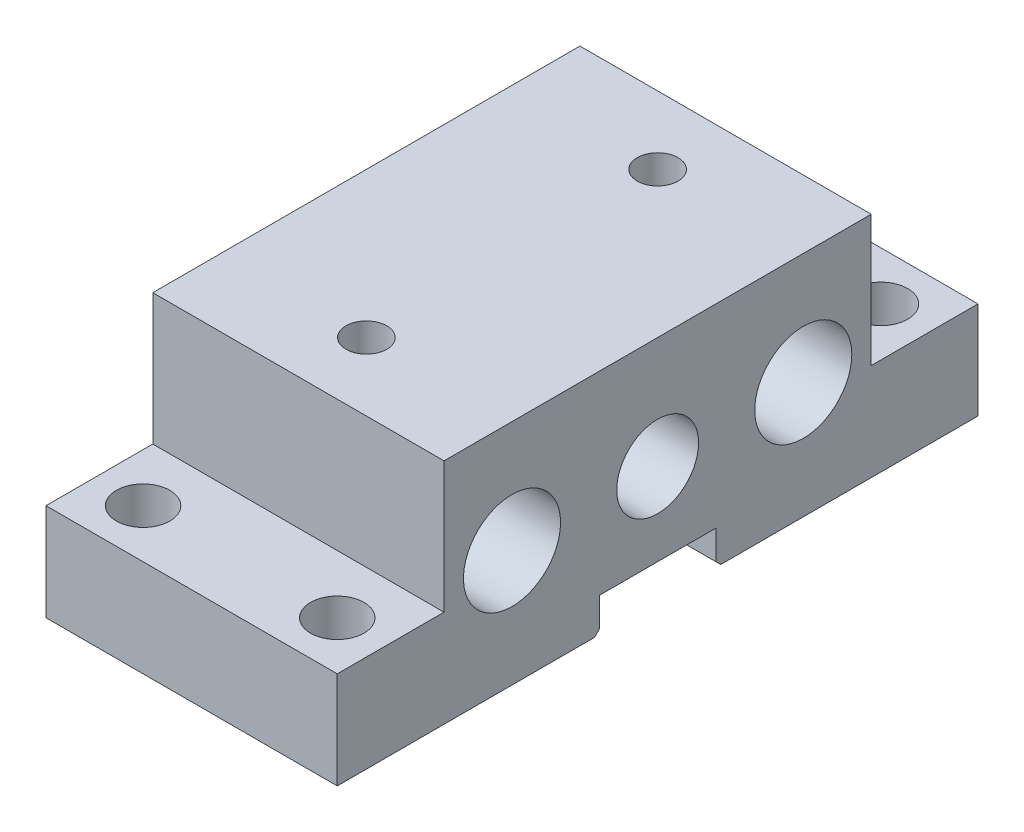
ISO-10303-21;
HEADER;
FILE_DESCRIPTION(('STEP AP214'),'2;1');
FILE_NAME('part.step','',(''),(''),'','','');
FILE_SCHEMA(('AUTOMOTIVE_DESIGN { 1 0 10303 214 1 1 1 1 }'));
ENDSEC;
DATA;
#1=APPLICATION_CONTEXT('core data for automotive mechanical design processes');
#2=APPLICATION_PROTOCOL_DEFINITION('international standard','automotive_design',2000,#1);
#3=PRODUCT_CONTEXT('',#1,'mechanical');
#4=PRODUCT('Part','Part','',(#3));
#5=PRODUCT_RELATED_PRODUCT_CATEGORY('part','',(#4));
#6=PRODUCT_DEFINITION_FORMATION('','',#4);
#7=PRODUCT_DEFINITION_CONTEXT('part definition',#1,'design');
#8=PRODUCT_DEFINITION('design','',#6,#7);
#9=PRODUCT_DEFINITION_SHAPE('','',#8);
#10=(LENGTH_UNIT() NAMED_UNIT(*) SI_UNIT(.MILLI.,.METRE.));
#11=(NAMED_UNIT(*) PLANE_ANGLE_UNIT() SI_UNIT($,.RADIAN.));
#12=(NAMED_UNIT(*) SI_UNIT($,.STERADIAN.) SOLID_ANGLE_UNIT());
#13=UNCERTAINTY_MEASURE_WITH_UNIT(LENGTH_MEASURE(1.E-05),#10,'distance_accuracy_value','');
#14=(GEOMETRIC_REPRESENTATION_CONTEXT(3) GLOBAL_UNCERTAINTY_ASSIGNED_CONTEXT((#13)) GLOBAL_UNIT_ASSIGNED_CONTEXT((#10,
#11,#12)) REPRESENTATION_CONTEXT('',''));
#15=CARTESIAN_POINT('',(0.,0.,0.));
#16=DIRECTION('',(0.,0.,1.));
#17=DIRECTION('',(1.,0.,0.));
#18=AXIS2_PLACEMENT_3D('',#15,#16,#17);
#19=CARTESIAN_POINT('',(15.,0.,33.));
#20=DIRECTION('',(0.,1.,0.));
#21=DIRECTION('',(0.,0.,1.));
#22=AXIS2_PLACEMENT_3D('',#19,#20,#21);
#23=PLANE('',#22);
#24=CARTESIAN_POINT('',(-10.,0.,28.));
#25=DIRECTION('',(0.,1.,0.));
#26=DIRECTION('',(0.,0.,1.));
#27=AXIS2_PLACEMENT_3D('',#24,#25,#26);
#28=CIRCLE('',#27,2.75);
#29=CARTESIAN_POINT('',(-10.,0.,30.75));
#30=VERTEX_POINT('',#29);
#31=EDGE_CURVE('E160',#30,#30,#28,.T.);
#32=ORIENTED_EDGE('',*,*,#31,.T.);
#33=EDGE_LOOP('',(#32));
#34=FACE_BOUND('',#33,.T.);
#35=CARTESIAN_POINT('',(10.,0.,28.));
#36=DIRECTION('',(0.,1.,0.));
#37=DIRECTION('',(0.,0.,1.));
#38=AXIS2_PLACEMENT_3D('',#35,#36,#37);
#39=CIRCLE('',#38,2.75);
#40=CARTESIAN_POINT('',(10.,0.,30.75));
#41=VERTEX_POINT('',#40);
#42=EDGE_CURVE('E153',#41,#41,#39,.T.);
#43=ORIENTED_EDGE('',*,*,#42,.T.);
#44=EDGE_LOOP('',(#43));
#45=FACE_BOUND('',#44,.T.);
#46=DIRECTION('',(0.,0.,-1.));
#47=VECTOR('',#46,1.);
#48=CARTESIAN_POINT('',(-15.,0.,33.));
#49=LINE('',#48,#47);
#50=CARTESIAN_POINT('',(-15.,0.,33.));
#51=VERTEX_POINT('',#50);
#52=CARTESIAN_POINT('',(-15.,0.,6.5));
#53=VERTEX_POINT('',#52);
#54=EDGE_CURVE('E198',#51,#53,#49,.T.);
#55=ORIENTED_EDGE('',*,*,#54,.T.);
#56=DIRECTION('',(1.,0.,0.));
#57=VECTOR('',#56,1.);
#58=CARTESIAN_POINT('',(15.,0.,6.5));
#59=LINE('',#58,#57);
#60=CARTESIAN_POINT('',(15.,0.,6.5));
#61=VERTEX_POINT('',#60);
#62=EDGE_CURVE('E11',#53,#61,#59,.T.);
#63=ORIENTED_EDGE('',*,*,#62,.T.);
#64=DIRECTION('',(0.,0.,-1.));
#65=VECTOR('',#64,1.);
#66=CARTESIAN_POINT('',(15.,0.,33.));
#67=LINE('',#66,#65);
#68=CARTESIAN_POINT('',(15.,0.,33.));
#69=VERTEX_POINT('',#68);
#70=EDGE_CURVE('E211',#69,#61,#67,.T.);
#71=ORIENTED_EDGE('',*,*,#70,.F.);
#72=DIRECTION('',(-1.,0.,0.));
#73=VECTOR('',#72,1.);
#74=CARTESIAN_POINT('',(15.,0.,33.));
#75=LINE('',#74,#73);
#76=EDGE_CURVE('E233',#69,#51,#75,.T.);
#77=ORIENTED_EDGE('',*,*,#76,.T.);
#78=EDGE_LOOP('',(#55,#63,#71,#77));
#79=FACE_BOUND('',#78,.T.);
#80=ADVANCED_FACE('F17',(#34,#45,#79),#23,.F.);
#81=CARTESIAN_POINT('',(15.,10.,-33.));
#82=DIRECTION('',(0.,0.,1.));
#83=DIRECTION('',(1.,0.,0.));
#84=AXIS2_PLACEMENT_3D('',#81,#82,#83);
#85=PLANE('',#84);
#86=DIRECTION('',(0.,1.,0.));
#87=VECTOR('',#86,1.);
#88=CARTESIAN_POINT('',(-15.,10.,-33.));
#89=LINE('',#88,#87);
#90=CARTESIAN_POINT('',(-15.,0.,-33.));
#91=VERTEX_POINT('',#90);
#92=CARTESIAN_POINT('',(-15.,10.,-33.));
#93=VERTEX_POINT('',#92);
#94=EDGE_CURVE('E193',#91,#93,#89,.T.);
#95=ORIENTED_EDGE('',*,*,#94,.T.);
#96=DIRECTION('',(-1.,0.,0.));
#97=VECTOR('',#96,1.);
#98=CARTESIAN_POINT('',(15.,10.,-33.));
#99=LINE('',#98,#97);
#100=CARTESIAN_POINT('',(15.,10.,-33.));
#101=VERTEX_POINT('',#100);
#102=EDGE_CURVE('E251',#101,#93,#99,.T.);
#103=ORIENTED_EDGE('',*,*,#102,.F.);
#104=DIRECTION('',(0.,1.,0.));
#105=VECTOR('',#104,1.);
#106=CARTESIAN_POINT('',(15.,10.,-33.));
#107=LINE('',#106,#105);
#108=CARTESIAN_POINT('',(15.,0.,-33.));
#109=VERTEX_POINT('',#108);
#110=EDGE_CURVE('E194',#109,#101,#107,.T.);
#111=ORIENTED_EDGE('',*,*,#110,.F.);
#112=DIRECTION('',(-1.,0.,0.));
#113=VECTOR('',#112,1.);
#114=CARTESIAN_POINT('',(15.,0.,-33.));
#115=LINE('',#114,#113);
#116=EDGE_CURVE('E214',#109,#91,#115,.T.);
#117=ORIENTED_EDGE('',*,*,#116,.T.);
#118=EDGE_LOOP('',(#95,#103,#111,#117));
#119=FACE_BOUND('',#118,.T.);
#120=ADVANCED_FACE('F343',(#119),#85,.F.);
#121=CARTESIAN_POINT('',(15.,10.,-22.));
#122=DIRECTION('',(0.,-1.,0.));
#123=DIRECTION('',(0.,0.,-1.));
#124=AXIS2_PLACEMENT_3D('',#121,#122,#123);
#125=PLANE('',#124);
#126=CARTESIAN_POINT('',(10.,10.,-28.));
#127=DIRECTION('',(0.,1.,0.));
#128=DIRECTION('',(0.,0.,1.));
#129=AXIS2_PLACEMENT_3D('',#126,#127,#128);
#130=CIRCLE('',#129,2.75);
#131=CARTESIAN_POINT('',(10.,10.,-25.25));
#132=VERTEX_POINT('',#131);
#133=EDGE_CURVE('E163',#132,#132,#130,.T.);
#134=ORIENTED_EDGE('',*,*,#133,.F.);
#135=EDGE_LOOP('',(#134));
#136=FACE_BOUND('',#135,.T.);
#137=CARTESIAN_POINT('',(-10.,10.,-28.));
#138=DIRECTION('',(0.,1.,0.));
#139=DIRECTION('',(0.,0.,1.));
#140=AXIS2_PLACEMENT_3D('',#137,#138,#139);
#141=CIRCLE('',#140,2.75);
#142=CARTESIAN_POINT('',(-10.,10.,-25.25));
#143=VERTEX_POINT('',#142);
#144=EDGE_CURVE('E169',#143,#143,#141,.T.);
#145=ORIENTED_EDGE('',*,*,#144,.F.);
#146=EDGE_LOOP('',(#145));
#147=FACE_BOUND('',#146,.T.);
#148=DIRECTION('',(0.,0.,1.));
#149=VECTOR('',#148,1.);
#150=CARTESIAN_POINT('',(-15.,10.,-22.));
#151=LINE('',#150,#149);
#152=CARTESIAN_POINT('',(-15.,10.,-22.));
#153=VERTEX_POINT('',#152);
#154=EDGE_CURVE('E217',#93,#153,#151,.T.);
#155=ORIENTED_EDGE('',*,*,#154,.T.);
#156=DIRECTION('',(-1.,0.,0.));
#157=VECTOR('',#156,1.);
#158=CARTESIAN_POINT('',(15.,10.,-22.));
#159=LINE('',#158,#157);
#160=CARTESIAN_POINT('',(15.,10.,-22.));
#161=VERTEX_POINT('',#160);
#162=EDGE_CURVE('E248',#161,#153,#159,.T.);
#163=ORIENTED_EDGE('',*,*,#162,.F.);
#164=DIRECTION('',(0.,0.,1.));
#165=VECTOR('',#164,1.);
#166=CARTESIAN_POINT('',(15.,10.,-22.));
#167=LINE('',#166,#165);
#168=EDGE_CURVE('E197',#101,#161,#167,.T.);
#169=ORIENTED_EDGE('',*,*,#168,.F.);
#170=ORIENTED_EDGE('',*,*,#102,.T.);
#171=EDGE_LOOP('',(#155,#163,#169,#170));
#172=FACE_BOUND('',#171,.T.);
#173=ADVANCED_FACE('F340',(#136,#147,#172),#125,.F.);
#174=CARTESIAN_POINT('',(15.,23.5,-22.));
#175=DIRECTION('',(0.,0.,1.));
#176=DIRECTION('',(1.,0.,0.));
#177=AXIS2_PLACEMENT_3D('',#174,#175,#176);
#178=PLANE('',#177);
#179=DIRECTION('',(0.,1.,0.));
#180=VECTOR('',#179,1.);
#181=CARTESIAN_POINT('',(-15.,23.5,-22.));
#182=LINE('',#181,#180);
#183=CARTESIAN_POINT('',(-15.,23.5,-22.));
#184=VERTEX_POINT('',#183);
#185=EDGE_CURVE('E219',#153,#184,#182,.T.);
#186=ORIENTED_EDGE('',*,*,#185,.T.);
#187=DIRECTION('',(-1.,0.,0.));
#188=VECTOR('',#187,1.);
#189=CARTESIAN_POINT('',(15.,23.5,-22.));
#190=LINE('',#189,#188);
#191=CARTESIAN_POINT('',(15.,23.5,-22.));
#192=VERTEX_POINT('',#191);
#193=EDGE_CURVE('E245',#192,#184,#190,.T.);
#194=ORIENTED_EDGE('',*,*,#193,.F.);
#195=DIRECTION('',(0.,1.,0.));
#196=VECTOR('',#195,1.);
#197=CARTESIAN_POINT('',(15.,23.5,-22.));
#198=LINE('',#197,#196);
#199=EDGE_CURVE('E200',#161,#192,#198,.T.);
#200=ORIENTED_EDGE('',*,*,#199,.F.);
#201=ORIENTED_EDGE('',*,*,#162,.T.);
#202=EDGE_LOOP('',(#186,#194,#200,#201));
#203=FACE_BOUND('',#202,.T.);
#204=ADVANCED_FACE('F306',(#203),#178,.F.);
#205=CARTESIAN_POINT('',(15.,23.5,-22.));
#206=DIRECTION('',(0.,-1.,0.));
#207=DIRECTION('',(0.,0.,-1.));
#208=AXIS2_PLACEMENT_3D('',#205,#206,#207);
#209=PLANE('',#208);
#210=CARTESIAN_POINT('',(0.,23.5,-15.));
#211=DIRECTION('',(0.,1.,0.));
#212=DIRECTION('',(0.,0.,1.));
#213=AXIS2_PLACEMENT_3D('',#210,#211,#212);
#214=CIRCLE('',#213,2.1);
#215=CARTESIAN_POINT('',(0.,23.5,-12.9));
#216=VERTEX_POINT('',#215);
#217=EDGE_CURVE('E297',#216,#216,#214,.T.);
#218=ORIENTED_EDGE('',*,*,#217,.F.);
#219=EDGE_LOOP('',(#218));
#220=FACE_BOUND('',#219,.T.);
#221=CARTESIAN_POINT('',(0.,23.5,15.));
#222=DIRECTION('',(0.,1.,0.));
#223=DIRECTION('',(0.,0.,1.));
#224=AXIS2_PLACEMENT_3D('',#221,#222,#223);
#225=CIRCLE('',#224,2.1);
#226=CARTESIAN_POINT('',(0.,23.5,17.1));
#227=VERTEX_POINT('',#226);
#228=EDGE_CURVE('E278',#227,#227,#225,.T.);
#229=ORIENTED_EDGE('',*,*,#228,.F.);
#230=EDGE_LOOP('',(#229));
#231=FACE_BOUND('',#230,.T.);
#232=DIRECTION('',(0.,0.,1.));
#233=VECTOR('',#232,1.);
#234=CARTESIAN_POINT('',(-15.,23.5,-22.));
#235=LINE('',#234,#233);
#236=CARTESIAN_POINT('',(-15.,23.5,22.));
#237=VERTEX_POINT('',#236);
#238=EDGE_CURVE('E221',#184,#237,#235,.T.);
#239=ORIENTED_EDGE('',*,*,#238,.T.);
#240=DIRECTION('',(-1.,0.,0.));
#241=VECTOR('',#240,1.);
#242=CARTESIAN_POINT('',(15.,23.5,22.));
#243=LINE('',#242,#241);
#244=CARTESIAN_POINT('',(15.,23.5,22.));
#245=VERTEX_POINT('',#244);
#246=EDGE_CURVE('E242',#245,#237,#243,.T.);
#247=ORIENTED_EDGE('',*,*,#246,.F.);
#248=DIRECTION('',(0.,0.,1.));
#249=VECTOR('',#248,1.);
#250=CARTESIAN_POINT('',(15.,23.5,-22.));
#251=LINE('',#250,#249);
#252=EDGE_CURVE('E202',#192,#245,#251,.T.);
#253=ORIENTED_EDGE('',*,*,#252,.F.);
#254=ORIENTED_EDGE('',*,*,#193,.T.);
#255=EDGE_LOOP('',(#239,#247,#253,#254));
#256=FACE_BOUND('',#255,.T.);
#257=ADVANCED_FACE('F302',(#220,#231,#256),#209,.F.);
#258=CARTESIAN_POINT('',(15.,23.5,22.));
#259=DIRECTION('',(0.,0.,-1.));
#260=DIRECTION('',(-1.,0.,0.));
#261=AXIS2_PLACEMENT_3D('',#258,#259,#260);
#262=PLANE('',#261);
#263=DIRECTION('',(0.,-1.,0.));
#264=VECTOR('',#263,1.);
#265=CARTESIAN_POINT('',(-15.,23.5,22.));
#266=LINE('',#265,#264);
#267=CARTESIAN_POINT('',(-15.,10.,22.));
#268=VERTEX_POINT('',#267);
#269=EDGE_CURVE('E223',#237,#268,#266,.T.);
#270=ORIENTED_EDGE('',*,*,#269,.T.);
#271=DIRECTION('',(-1.,0.,0.));
#272=VECTOR('',#271,1.);
#273=CARTESIAN_POINT('',(15.,10.,22.));
#274=LINE('',#273,#272);
#275=CARTESIAN_POINT('',(15.,10.,22.));
#276=VERTEX_POINT('',#275);
#277=EDGE_CURVE('E239',#276,#268,#274,.T.);
#278=ORIENTED_EDGE('',*,*,#277,.F.);
#279=DIRECTION('',(0.,-1.,0.));
#280=VECTOR('',#279,1.);
#281=CARTESIAN_POINT('',(15.,23.5,22.));
#282=LINE('',#281,#280);
#283=EDGE_CURVE('E204',#245,#276,#282,.T.);
#284=ORIENTED_EDGE('',*,*,#283,.F.);
#285=ORIENTED_EDGE('',*,*,#246,.T.);
#286=EDGE_LOOP('',(#270,#278,#284,#285));
#287=FACE_BOUND('',#286,.T.);
#288=ADVANCED_FACE('F305',(#287),#262,.F.);
#289=CARTESIAN_POINT('',(15.,10.,22.));
#290=DIRECTION('',(0.,-1.,0.));
#291=DIRECTION('',(0.,0.,-1.));
#292=AXIS2_PLACEMENT_3D('',#289,#290,#291);
#293=PLANE('',#292);
#294=CARTESIAN_POINT('',(10.,10.,28.));
#295=DIRECTION('',(0.,1.,0.));
#296=DIRECTION('',(0.,0.,1.));
#297=AXIS2_PLACEMENT_3D('',#294,#295,#296);
#298=CIRCLE('',#297,2.75);
#299=CARTESIAN_POINT('',(10.,10.,30.75));
#300=VERTEX_POINT('',#299);
#301=EDGE_CURVE('E150',#300,#300,#298,.T.);
#302=ORIENTED_EDGE('',*,*,#301,.F.);
#303=EDGE_LOOP('',(#302));
#304=FACE_BOUND('',#303,.T.);
#305=CARTESIAN_POINT('',(-10.,10.,28.));
#306=DIRECTION('',(0.,1.,0.));
#307=DIRECTION('',(0.,0.,1.));
#308=AXIS2_PLACEMENT_3D('',#305,#306,#307);
#309=CIRCLE('',#308,2.75);
#310=CARTESIAN_POINT('',(-10.,10.,30.75));
#311=VERTEX_POINT('',#310);
#312=EDGE_CURVE('E157',#311,#311,#309,.T.);
#313=ORIENTED_EDGE('',*,*,#312,.F.);
#314=EDGE_LOOP('',(#313));
#315=FACE_BOUND('',#314,.T.);
#316=DIRECTION('',(0.,0.,1.));
#317=VECTOR('',#316,1.);
#318=CARTESIAN_POINT('',(-15.,10.,22.));
#319=LINE('',#318,#317);
#320=CARTESIAN_POINT('',(-15.,10.,33.));
#321=VERTEX_POINT('',#320);
#322=EDGE_CURVE('E225',#268,#321,#319,.T.);
#323=ORIENTED_EDGE('',*,*,#322,.T.);
#324=DIRECTION('',(-1.,0.,0.));
#325=VECTOR('',#324,1.);
#326=CARTESIAN_POINT('',(15.,10.,33.));
#327=LINE('',#326,#325);
#328=CARTESIAN_POINT('',(15.,10.,33.));
#329=VERTEX_POINT('',#328);
#330=EDGE_CURVE('E236',#329,#321,#327,.T.);
#331=ORIENTED_EDGE('',*,*,#330,.F.);
#332=DIRECTION('',(0.,0.,1.));
#333=VECTOR('',#332,1.);
#334=CARTESIAN_POINT('',(15.,10.,22.));
#335=LINE('',#334,#333);
#336=EDGE_CURVE('E206',#276,#329,#335,.T.);
#337=ORIENTED_EDGE('',*,*,#336,.F.);
#338=ORIENTED_EDGE('',*,*,#277,.T.);
#339=EDGE_LOOP('',(#323,#331,#337,#338));
#340=FACE_BOUND('',#339,.T.);
#341=ADVANCED_FACE('F324',(#304,#315,#340),#293,.F.);
#342=CARTESIAN_POINT('',(15.,10.,33.));
#343=DIRECTION('',(0.,0.,-1.));
#344=DIRECTION('',(-1.,0.,0.));
#345=AXIS2_PLACEMENT_3D('',#342,#343,#344);
#346=PLANE('',#345);
#347=DIRECTION('',(0.,-1.,0.));
#348=VECTOR('',#347,1.);
#349=CARTESIAN_POINT('',(-15.,10.,33.));
#350=LINE('',#349,#348);
#351=EDGE_CURVE('E227',#321,#51,#350,.T.);
#352=ORIENTED_EDGE('',*,*,#351,.T.);
#353=ORIENTED_EDGE('',*,*,#76,.F.);
#354=DIRECTION('',(0.,-1.,0.));
#355=VECTOR('',#354,1.);
#356=CARTESIAN_POINT('',(15.,10.,33.));
#357=LINE('',#356,#355);
#358=EDGE_CURVE('E208',#329,#69,#357,.T.);
#359=ORIENTED_EDGE('',*,*,#358,.F.);
#360=ORIENTED_EDGE('',*,*,#330,.T.);
#361=EDGE_LOOP('',(#352,#353,#359,#360));
#362=FACE_BOUND('',#361,.T.);
#363=ADVANCED_FACE('F328',(#362),#346,.F.);
#364=CARTESIAN_POINT('',(10.,0.,-28.));
#365=DIRECTION('',(0.,1.,0.));
#366=DIRECTION('',(0.,0.,1.));
#367=AXIS2_PLACEMENT_3D('',#364,#365,#366);
#368=CIRCLE('',#367,2.75);
#369=CARTESIAN_POINT('',(10.,0.,-25.25));
#370=VERTEX_POINT('',#369);
#371=EDGE_CURVE('E166',#370,#370,#368,.T.);
#372=ORIENTED_EDGE('',*,*,#371,.T.);
#373=EDGE_LOOP('',(#372));
#374=FACE_BOUND('',#373,.T.);
#375=CARTESIAN_POINT('',(-10.,0.,-28.));
#376=DIRECTION('',(0.,1.,0.));
#377=DIRECTION('',(0.,0.,1.));
#378=AXIS2_PLACEMENT_3D('',#375,#376,#377);
#379=CIRCLE('',#378,2.75);
#380=CARTESIAN_POINT('',(-10.,0.,-25.25));
#381=VERTEX_POINT('',#380);
#382=EDGE_CURVE('E172',#381,#381,#379,.T.);
#383=ORIENTED_EDGE('',*,*,#382,.T.);
#384=EDGE_LOOP('',(#383));
#385=FACE_BOUND('',#384,.T.);
#386=CARTESIAN_POINT('',(15.,0.,-6.5));
#387=VERTEX_POINT('',#386);
#388=EDGE_CURVE('E210',#387,#109,#67,.T.);
#389=ORIENTED_EDGE('',*,*,#388,.F.);
#390=DIRECTION('',(-1.,0.,0.));
#391=VECTOR('',#390,1.);
#392=CARTESIAN_POINT('',(15.,0.,-6.5));
#393=LINE('',#392,#391);
#394=CARTESIAN_POINT('',(-15.,0.,-6.5));
#395=VERTEX_POINT('',#394);
#396=EDGE_CURVE('E260',#387,#395,#393,.T.);
#397=ORIENTED_EDGE('',*,*,#396,.T.);
#398=EDGE_CURVE('E229',#395,#91,#49,.T.);
#399=ORIENTED_EDGE('',*,*,#398,.T.);
#400=ORIENTED_EDGE('',*,*,#116,.F.);
#401=EDGE_LOOP('',(#389,#397,#399,#400));
#402=FACE_BOUND('',#401,.T.);
#403=ADVANCED_FACE('F347',(#374,#385,#402),#23,.F.);
#404=CARTESIAN_POINT('',(15.,0.,0.));
#405=DIRECTION('',(1.,0.,0.));
#406=DIRECTION('',(0.,0.,-1.));
#407=AXIS2_PLACEMENT_3D('',#404,#405,#406);
#408=PLANE('',#407);
#409=DIRECTION('',(0.,-1.,0.));
#410=VECTOR('',#409,1.);
#411=CARTESIAN_POINT('',(15.,3.5,-6.));
#412=LINE('',#411,#410);
#413=CARTESIAN_POINT('',(15.,3.5,-6.));
#414=VERTEX_POINT('',#413);
#415=CARTESIAN_POINT('',(15.,0.5,-6.));
#416=VERTEX_POINT('',#415);
#417=EDGE_CURVE('E127',#414,#416,#412,.T.);
#418=ORIENTED_EDGE('',*,*,#417,.T.);
#419=DIRECTION('',(0.,0.707106781186549,0.707106781186546));
#420=VECTOR('',#419,1.);
#421=CARTESIAN_POINT('',(15.,3.25,-3.25));
#422=LINE('',#421,#420);
#423=EDGE_CURVE('E258',#416,#387,#422,.F.);
#424=ORIENTED_EDGE('',*,*,#423,.T.);
#425=ORIENTED_EDGE('',*,*,#388,.T.);
#426=ORIENTED_EDGE('',*,*,#110,.T.);
#427=ORIENTED_EDGE('',*,*,#168,.T.);
#428=ORIENTED_EDGE('',*,*,#199,.T.);
#429=ORIENTED_EDGE('',*,*,#252,.T.);
#430=ORIENTED_EDGE('',*,*,#283,.T.);
#431=ORIENTED_EDGE('',*,*,#336,.T.);
#432=ORIENTED_EDGE('',*,*,#358,.T.);
#433=ORIENTED_EDGE('',*,*,#70,.T.);
#434=DIRECTION('',(0.,-0.707106781186549,0.707106781186546));
#435=VECTOR('',#434,1.);
#436=CARTESIAN_POINT('',(15.,3.25,3.25));
#437=LINE('',#436,#435);
#438=CARTESIAN_POINT('',(15.,0.5,6.));
#439=VERTEX_POINT('',#438);
#440=EDGE_CURVE('E256',#61,#439,#437,.F.);
#441=ORIENTED_EDGE('',*,*,#440,.T.);
#442=DIRECTION('',(0.,-1.,0.));
#443=VECTOR('',#442,1.);
#444=CARTESIAN_POINT('',(15.,3.5,6.));
#445=LINE('',#444,#443);
#446=CARTESIAN_POINT('',(15.,3.5,6.));
#447=VERTEX_POINT('',#446);
#448=EDGE_CURVE('E145',#447,#439,#445,.T.);
#449=ORIENTED_EDGE('',*,*,#448,.F.);
#450=DIRECTION('',(0.,0.,1.));
#451=VECTOR('',#450,1.);
#452=CARTESIAN_POINT('',(15.,3.5,6.));
#453=LINE('',#452,#451);
#454=EDGE_CURVE('E130',#414,#447,#453,.T.);
#455=ORIENTED_EDGE('',*,*,#454,.F.);
#456=EDGE_LOOP('',(#418,#424,#425,#426,#427,#428,#429,#430,#431,#432,#433,#441,#449,#455));
#457=FACE_BOUND('',#456,.T.);
#458=CARTESIAN_POINT('',(15.,12.,0.));
#459=DIRECTION('',(1.,0.,0.));
#460=DIRECTION('',(0.,0.,-1.));
#461=AXIS2_PLACEMENT_3D('',#458,#459,#460);
#462=CIRCLE('',#461,4.2164);
#463=CARTESIAN_POINT('',(15.,12.,-4.2164));
#464=VERTEX_POINT('',#463);
#465=EDGE_CURVE('E175',#464,#464,#462,.T.);
#466=ORIENTED_EDGE('',*,*,#465,.F.);
#467=EDGE_LOOP('',(#466));
#468=FACE_BOUND('',#467,.T.);
#469=CARTESIAN_POINT('',(15.,12.,15.));
#470=DIRECTION('',(1.,0.,0.));
#471=DIRECTION('',(0.,0.,-1.));
#472=AXIS2_PLACEMENT_3D('',#469,#470,#471);
#473=CIRCLE('',#472,5.);
#474=CARTESIAN_POINT('',(15.,12.,10.));
#475=VERTEX_POINT('',#474);
#476=EDGE_CURVE('E181',#475,#475,#473,.T.);
#477=ORIENTED_EDGE('',*,*,#476,.F.);
#478=EDGE_LOOP('',(#477));
#479=FACE_BOUND('',#478,.T.);
#480=CARTESIAN_POINT('',(15.,12.,-15.));
#481=DIRECTION('',(1.,0.,0.));
#482=DIRECTION('',(0.,0.,-1.));
#483=AXIS2_PLACEMENT_3D('',#480,#481,#482);
#484=CIRCLE('',#483,5.);
#485=CARTESIAN_POINT('',(15.,12.,-20.));
#486=VERTEX_POINT('',#485);
#487=EDGE_CURVE('E187',#486,#486,#484,.T.);
#488=ORIENTED_EDGE('',*,*,#487,.F.);
#489=EDGE_LOOP('',(#488));
#490=FACE_BOUND('',#489,.T.);
#491=ADVANCED_FACE('F332',(#457,#468,#479,#490),#408,.T.);
#492=CARTESIAN_POINT('',(-15.,0.,0.));
#493=DIRECTION('',(1.,0.,0.));
#494=DIRECTION('',(0.,0.,-1.));
#495=AXIS2_PLACEMENT_3D('',#492,#493,#494);
#496=PLANE('',#495);
#497=CARTESIAN_POINT('',(-15.,12.,0.));
#498=DIRECTION('',(1.,0.,0.));
#499=DIRECTION('',(0.,0.,-1.));
#500=AXIS2_PLACEMENT_3D('',#497,#498,#499);
#501=CIRCLE('',#500,4.2164);
#502=CARTESIAN_POINT('',(-15.,12.,-4.2164));
#503=VERTEX_POINT('',#502);
#504=EDGE_CURVE('E178',#503,#503,#501,.T.);
#505=ORIENTED_EDGE('',*,*,#504,.T.);
#506=EDGE_LOOP('',(#505));
#507=FACE_BOUND('',#506,.T.);
#508=CARTESIAN_POINT('',(-15.,12.,15.));
#509=DIRECTION('',(1.,0.,0.));
#510=DIRECTION('',(0.,0.,-1.));
#511=AXIS2_PLACEMENT_3D('',#508,#509,#510);
#512=CIRCLE('',#511,5.);
#513=CARTESIAN_POINT('',(-15.,12.,10.));
#514=VERTEX_POINT('',#513);
#515=EDGE_CURVE('E184',#514,#514,#512,.T.);
#516=ORIENTED_EDGE('',*,*,#515,.T.);
#517=EDGE_LOOP('',(#516));
#518=FACE_BOUND('',#517,.T.);
#519=CARTESIAN_POINT('',(-15.,12.,-15.));
#520=DIRECTION('',(1.,0.,0.));
#521=DIRECTION('',(0.,0.,-1.));
#522=AXIS2_PLACEMENT_3D('',#519,#520,#521);
#523=CIRCLE('',#522,5.);
#524=CARTESIAN_POINT('',(-15.,12.,-20.));
#525=VERTEX_POINT('',#524);
#526=EDGE_CURVE('E190',#525,#525,#523,.T.);
#527=ORIENTED_EDGE('',*,*,#526,.T.);
#528=EDGE_LOOP('',(#527));
#529=FACE_BOUND('',#528,.T.);
#530=ORIENTED_EDGE('',*,*,#398,.F.);
#531=DIRECTION('',(0.,-0.707106781186549,-0.707106781186546));
#532=VECTOR('',#531,1.);
#533=CARTESIAN_POINT('',(-15.,0.5,-6.));
#534=LINE('',#533,#532);
#535=CARTESIAN_POINT('',(-15.,0.5,-6.));
#536=VERTEX_POINT('',#535);
#537=EDGE_CURVE('E143',#395,#536,#534,.F.);
#538=ORIENTED_EDGE('',*,*,#537,.T.);
#539=DIRECTION('',(0.,-1.,0.));
#540=VECTOR('',#539,1.);
#541=CARTESIAN_POINT('',(-15.,3.5,-6.));
#542=LINE('',#541,#540);
#543=CARTESIAN_POINT('',(-15.,3.5,-6.));
#544=VERTEX_POINT('',#543);
#545=EDGE_CURVE('E124',#544,#536,#542,.T.);
#546=ORIENTED_EDGE('',*,*,#545,.F.);
#547=DIRECTION('',(0.,0.,-1.));
#548=VECTOR('',#547,1.);
#549=CARTESIAN_POINT('',(-15.,3.5,6.));
#550=LINE('',#549,#548);
#551=CARTESIAN_POINT('',(-15.,3.5,6.));
#552=VERTEX_POINT('',#551);
#553=EDGE_CURVE('E131',#552,#544,#550,.T.);
#554=ORIENTED_EDGE('',*,*,#553,.F.);
#555=DIRECTION('',(0.,-1.,0.));
#556=VECTOR('',#555,1.);
#557=CARTESIAN_POINT('',(-15.,3.5,6.));
#558=LINE('',#557,#556);
#559=CARTESIAN_POINT('',(-15.,0.5,6.));
#560=VERTEX_POINT('',#559);
#561=EDGE_CURVE('E154',#552,#560,#558,.T.);
#562=ORIENTED_EDGE('',*,*,#561,.T.);
#563=DIRECTION('',(0.,0.707106781186549,-0.707106781186546));
#564=VECTOR('',#563,1.);
#565=CARTESIAN_POINT('',(-15.,0.5,6.));
#566=LINE('',#565,#564);
#567=EDGE_CURVE('E33',#560,#53,#566,.F.);
#568=ORIENTED_EDGE('',*,*,#567,.T.);
#569=ORIENTED_EDGE('',*,*,#54,.F.);
#570=ORIENTED_EDGE('',*,*,#351,.F.);
#571=ORIENTED_EDGE('',*,*,#322,.F.);
#572=ORIENTED_EDGE('',*,*,#269,.F.);
#573=ORIENTED_EDGE('',*,*,#238,.F.);
#574=ORIENTED_EDGE('',*,*,#185,.F.);
#575=ORIENTED_EDGE('',*,*,#154,.F.);
#576=ORIENTED_EDGE('',*,*,#94,.F.);
#577=EDGE_LOOP('',(#530,#538,#546,#554,#562,#568,#569,#570,#571,#572,#573,#574,#575,#576));
#578=FACE_BOUND('',#577,.T.);
#579=ADVANCED_FACE('F141',(#507,#518,#529,#578),#496,.F.);
#580=CARTESIAN_POINT('',(15.,12.,-15.));
#581=DIRECTION('',(1.,0.,0.));
#582=DIRECTION('',(0.,0.,-1.));
#583=AXIS2_PLACEMENT_3D('',#580,#581,#582);
#584=CYLINDRICAL_SURFACE('',#583,5.);
#585=CARTESIAN_POINT('',(0.,16.5376205218154,-12.9));
#586=CARTESIAN_POINT('',(0.1119250215795,16.537629434056,-12.9000090607814));
#587=CARTESIAN_POINT('',(0.224014630589445,16.541820561908,-12.9090023798677));
#588=CARTESIAN_POINT('',(0.444960990561797,16.5580436120359,-12.9446170426493));
#589=CARTESIAN_POINT('',(0.553808199026751,16.5700966670744,-12.9712859010942));
#590=CARTESIAN_POINT('',(0.764662199942396,16.6004193538091,-13.0410285498126));
#591=CARTESIAN_POINT('',(0.866695170858789,16.6186633347609,-13.0840347364086));
#592=CARTESIAN_POINT('',(1.06206955023301,16.6592746568167,-13.1850315137196));
#593=CARTESIAN_POINT('',(1.15541291104179,16.681641068326,-13.2430187274435));
#594=CARTESIAN_POINT('',(1.33671724330484,16.7295590712973,-13.3762525985205));
#595=CARTESIAN_POINT('',(1.42406233325485,16.755219776632,-13.452298490994));
#596=CARTESIAN_POINT('',(1.58521580093076,16.8059388812481,-13.6178132662158));
#597=CARTESIAN_POINT('',(1.65901891032726,16.8309970428374,-13.70728734852));
#598=CARTESIAN_POINT('',(1.79415229795834,16.8790175468232,-13.9019734291894));
#599=CARTESIAN_POINT('',(1.85478717867416,16.901838318974,-14.0077062077224));
#600=CARTESIAN_POINT('',(1.95714229347264,16.9414744522502,-14.2290031992793));
#601=CARTESIAN_POINT('',(1.99887105186571,16.9582925191219,-14.3445629535894));
#602=CARTESIAN_POINT('',(2.0599896837342,16.9832540503312,-14.5757650768591));
#603=CARTESIAN_POINT('',(2.08044225007981,16.9918084678881,-14.691081241615));
#604=CARTESIAN_POINT('',(2.10186418581282,17.000773136978,-14.9238046359517));
#605=CARTESIAN_POINT('',(2.10284159232137,17.001186748105,-15.0412109829217));
#606=CARTESIAN_POINT('',(2.08583701233113,16.9940634700689,-15.2670456919929));
#607=CARTESIAN_POINT('',(2.06902332811793,16.987016486703,-15.3755803892405));
#608=CARTESIAN_POINT('',(2.01891976810438,16.9664391322881,-15.5881214539724));
#609=CARTESIAN_POINT('',(1.98562867673431,16.9529082829143,-15.6921274867524));
#610=CARTESIAN_POINT('',(1.90312291562025,16.920408726166,-15.8945715927336));
#611=CARTESIAN_POINT('',(1.85367274835417,16.9013601016406,-15.992900328996));
#612=CARTESIAN_POINT('',(1.74048555525024,16.8596835881745,-16.1801220123184));
#613=CARTESIAN_POINT('',(1.67674345464769,16.8370544287033,-16.2690115911705));
#614=CARTESIAN_POINT('',(1.53148674860764,16.7885738229464,-16.4415823112684));
#615=CARTESIAN_POINT('',(1.44902762604874,16.7626076685562,-16.5244373505064));
#616=CARTESIAN_POINT('',(1.27133595771935,16.7115877083249,-16.675503582857));
#617=CARTESIAN_POINT('',(1.17609834784709,16.6865342692228,-16.7437089423021));
#618=CARTESIAN_POINT('',(0.971486005676054,16.6393495494543,-16.8657088163384));
#619=CARTESIAN_POINT('',(0.861741870718783,16.6173458825136,-16.9189374060992));
#620=CARTESIAN_POINT('',(0.633678315231677,16.5802778028242,-17.0058197204617));
#621=CARTESIAN_POINT('',(0.515365211815366,16.5652083371954,-17.0394877033862));
#622=CARTESIAN_POINT('',(0.281805089891414,16.5449737425502,-17.0841738344455));
#623=CARTESIAN_POINT('',(0.166866286706922,16.5392236069243,-17.0965332286571));
#624=CARTESIAN_POINT('',(-0.063562067090105,16.5366053771782,-17.1021961322576));
#625=CARTESIAN_POINT('',(-0.179051407448838,16.5397341271019,-17.0955064125574));
#626=CARTESIAN_POINT('',(-0.399327287214083,16.5539159411754,-17.0644854956339));
#627=CARTESIAN_POINT('',(-0.504319333691304,16.5644364488022,-17.0413387175566));
#628=CARTESIAN_POINT('',(-0.708839472327894,16.5915317847849,-16.9796369991441));
#629=CARTESIAN_POINT('',(-0.808366267314666,16.6081080433844,-16.9410784186565));
#630=CARTESIAN_POINT('',(-1.00388018358943,16.6463081914254,-16.8478242754604));
#631=CARTESIAN_POINT('',(-1.0995349373015,16.6681173181401,-16.7925102260696));
#632=CARTESIAN_POINT('',(-1.28066928628021,16.7140664432666,-16.6679272986974));
#633=CARTESIAN_POINT('',(-1.36614440165724,16.7382074595021,-16.5986523125798));
#634=CARTESIAN_POINT('',(-1.53187599958732,16.7885171392414,-16.4413410570557));
#635=CARTESIAN_POINT('',(-1.61111104666185,16.8146878460106,-16.3522250420572));
#636=CARTESIAN_POINT('',(-1.75369076460977,16.8642527586253,-16.1613598024618));
#637=CARTESIAN_POINT('',(-1.81703415670509,16.8876467409522,-16.0596095621916));
#638=CARTESIAN_POINT('',(-1.92600056379199,16.9291912862504,-15.845565277087));
#639=CARTESIAN_POINT('',(-1.97156644347112,16.9473248957463,-15.733238653289));
#640=CARTESIAN_POINT('',(-2.04281807511936,16.9761464264512,-15.5015556463592));
#641=CARTESIAN_POINT('',(-2.06851587006697,16.9868388577143,-15.3822035689776));
#642=CARTESIAN_POINT('',(-2.0977675487916,16.9990469662338,-15.1489798929579));
#643=CARTESIAN_POINT('',(-2.10276090687133,17.0011589670716,-15.0353188535759));
#644=CARTESIAN_POINT('',(-2.0943459505535,16.9976262578203,-14.8088157251006));
#645=CARTESIAN_POINT('',(-2.08094095443379,16.9919829464584,-14.6959734920193));
#646=CARTESIAN_POINT('',(-2.0371433091974,16.9738896598413,-14.4785580388536));
#647=CARTESIAN_POINT('',(-2.00738813926432,16.9616954737698,-14.373833334677));
#648=CARTESIAN_POINT('',(-1.93243639847655,16.9318487541626,-14.1709063400095));
#649=CARTESIAN_POINT('',(-1.8872369189924,16.9141951925212,-14.0727052822821));
#650=CARTESIAN_POINT('',(-1.78039142799545,16.874139353499,-13.8807057945202));
#651=CARTESIAN_POINT('',(-1.71809268360156,16.8515580691258,-13.7873088146996));
#652=CARTESIAN_POINT('',(-1.57976342318214,16.8043134556825,-13.6118941713507));
#653=CARTESIAN_POINT('',(-1.50372771150163,16.7796493407214,-13.5298808342184));
#654=CARTESIAN_POINT('',(-1.33386036832528,16.7288667589723,-13.3736449630175));
#655=CARTESIAN_POINT('',(-1.23916045371802,16.7027660053021,-13.3003566926375));
#656=CARTESIAN_POINT('',(-1.03803689244785,16.6538160497482,-13.1705680372264));
#657=CARTESIAN_POINT('',(-0.931606671756762,16.6309686877735,-13.1140771322096));
#658=CARTESIAN_POINT('',(-0.710020386907038,16.5915547440116,-13.0200385843697));
#659=CARTESIAN_POINT('',(-0.594905255227777,16.5749606683971,-12.9824077724299));
#660=CARTESIAN_POINT('',(-0.418328391064129,16.5564836168911,-12.9411981139379));
#661=CARTESIAN_POINT('',(-0.358877879929046,16.5513954338818,-12.9300044597474));
#662=CARTESIAN_POINT('',(-0.239093127632792,16.5435245383436,-12.9127812456398));
#663=CARTESIAN_POINT('',(-0.178759531865776,16.5407402200594,-12.9067480888431));
#664=CARTESIAN_POINT('',(-0.0788982996772146,16.5381340572084,-12.9011102901712));
#665=CARTESIAN_POINT('',(-0.0394593783580261,16.537617379788,-12.8999968056043));
#666=CARTESIAN_POINT('',(0.,16.5376205218154,-12.9));
#667=B_SPLINE_CURVE_WITH_KNOTS('',3,(#585,#586,#587,#588,#589,#590,#591,#592,#593,#594,#595,
#596,#597,#598,#599,#600,#601,#602,#603,#604,#605,#606,#607,#608,#609,#610,#611,#612,#613,#614,
#615,#616,#617,#618,#619,#620,#621,#622,#623,#624,#625,#626,#627,#628,#629,#630,#631,#632,#633,
#634,#635,#636,#637,#638,#639,#640,#641,#642,#643,#644,#645,#646,#647,#648,#649,#650,#651,#652,
#653,#654,#655,#656,#657,#658,#659,#660,#661,#662,#663,#664,#665,#666),.UNSPECIFIED.,.T.,.F.,(4,
2,2,2,2,2,2,2,2,2,2,2,2,2,2,2,2,2,2,2,2,2,2,2,2,2,2,2,2,2,2,2,2,2,2,2,2,2,2,2,4),(0.,
0.335635656606171,0.672177236307958,1.00734111814836,1.3424295138839,1.69673924977881,
2.05118653430915,2.42129877812726,2.79124398086995,3.14166571369556,3.49194282946521,
3.82056640937209,4.14921423608072,4.48288287547885,4.81667018174635,5.17430973536722,
5.53209144212974,5.90198342971282,6.27160545236006,6.61697414039906,6.96222008421919,
7.28484865641396,7.60755347613731,7.94403128513028,8.28065662947255,8.6452123517331,
9.00979739985342,9.37554472437892,9.7410701780982,10.0807065690479,10.4202817121371,
10.7474704702579,11.0747208818873,11.4168078835367,11.7590245427136,12.1249656183702,
12.4911128317485,12.8556308833964,13.0375398024423,13.2193218269542,13.3376508134272),.UNSPECIFIED.);
#668=CARTESIAN_POINT('',(0.,16.5376205218154,-12.9));
#669=VERTEX_POINT('',#668);
#670=EDGE_CURVE('E291',#669,#669,#667,.T.);
#671=ORIENTED_EDGE('',*,*,#670,.T.);
#672=EDGE_LOOP('',(#671));
#673=FACE_BOUND('',#672,.T.);
#674=ORIENTED_EDGE('',*,*,#526,.F.);
#675=EDGE_LOOP('',(#674));
#676=FACE_BOUND('',#675,.T.);
#677=ORIENTED_EDGE('',*,*,#487,.T.);
#678=EDGE_LOOP('',(#677));
#679=FACE_BOUND('',#678,.T.);
#680=ADVANCED_FACE('F428',(#673,#676,#679),#584,.F.);
#681=CARTESIAN_POINT('',(15.,12.,15.));
#682=DIRECTION('',(1.,0.,0.));
#683=DIRECTION('',(0.,0.,-1.));
#684=AXIS2_PLACEMENT_3D('',#681,#682,#683);
#685=CYLINDRICAL_SURFACE('',#684,5.);
#686=CARTESIAN_POINT('',(0.,16.5376205218154,17.1));
#687=CARTESIAN_POINT('',(0.111925021579502,16.537629434056,17.0999909392185));
#688=CARTESIAN_POINT('',(0.224014630589447,16.541820561908,17.0909976201323));
#689=CARTESIAN_POINT('',(0.444960990561798,16.5580436120359,17.0553829573507));
#690=CARTESIAN_POINT('',(0.553808199026752,16.5700966670744,17.0287140989058));
#691=CARTESIAN_POINT('',(0.764662199942394,16.6004193538091,16.9589714501874));
#692=CARTESIAN_POINT('',(0.866695170858784,16.6186633347609,16.9159652635914));
#693=CARTESIAN_POINT('',(1.06206955023301,16.6592746568167,16.8149684862804));
#694=CARTESIAN_POINT('',(1.15541291104179,16.681641068326,16.7569812725565));
#695=CARTESIAN_POINT('',(1.33671724330485,16.7295590712973,16.6237474014795));
#696=CARTESIAN_POINT('',(1.42406233325486,16.755219776632,16.547701509006));
#697=CARTESIAN_POINT('',(1.58521580093076,16.8059388812481,16.3821867337842));
#698=CARTESIAN_POINT('',(1.65901891032726,16.8309970428374,16.2927126514799));
#699=CARTESIAN_POINT('',(1.79415229795834,16.8790175468232,16.0980265708106));
#700=CARTESIAN_POINT('',(1.85478717867417,16.901838318974,15.9922937922776));
#701=CARTESIAN_POINT('',(1.95714229347264,16.9414744522502,15.7709968007207));
#702=CARTESIAN_POINT('',(1.99887105186571,16.9582925191219,15.6554370464106));
#703=CARTESIAN_POINT('',(2.0599896837342,16.9832540503313,15.4242349231409));
#704=CARTESIAN_POINT('',(2.08044225007981,16.9918084678881,15.308918758385));
#705=CARTESIAN_POINT('',(2.10186418581282,17.000773136978,15.0761953640483));
#706=CARTESIAN_POINT('',(2.10284159232137,17.001186748105,14.9587890170783));
#707=CARTESIAN_POINT('',(2.08583701233112,16.9940634700689,14.7329543080071));
#708=CARTESIAN_POINT('',(2.06902332811792,16.987016486703,14.6244196107595));
#709=CARTESIAN_POINT('',(2.01891976810438,16.9664391322881,14.4118785460276));
#710=CARTESIAN_POINT('',(1.98562867673432,16.9529082829143,14.3078725132476));
#711=CARTESIAN_POINT('',(1.90312291562025,16.920408726166,14.1054284072664));
#712=CARTESIAN_POINT('',(1.85367274835416,16.9013601016406,14.007099671004));
#713=CARTESIAN_POINT('',(1.74048555525023,16.8596835881745,13.8198779876816));
#714=CARTESIAN_POINT('',(1.67674345464768,16.8370544287033,13.7309884088295));
#715=CARTESIAN_POINT('',(1.53148674860764,16.7885738229465,13.5584176887316));
#716=CARTESIAN_POINT('',(1.44902762604873,16.7626076685562,13.4755626494936));
#717=CARTESIAN_POINT('',(1.27133595771934,16.7115877083249,13.324496417143));
#718=CARTESIAN_POINT('',(1.17609834784709,16.6865342692228,13.2562910576979));
#719=CARTESIAN_POINT('',(0.971486005676057,16.6393495494543,13.1342911836616));
#720=CARTESIAN_POINT('',(0.861741870718784,16.6173458825136,13.0810625939008));
#721=CARTESIAN_POINT('',(0.633678315231677,16.5802778028242,12.9941802795383));
#722=CARTESIAN_POINT('',(0.515365211815366,16.5652083371954,12.9605122966138));
#723=CARTESIAN_POINT('',(0.281805089891415,16.5449737425502,12.9158261655545));
#724=CARTESIAN_POINT('',(0.166866286706923,16.5392236069243,12.9034667713429));
#725=CARTESIAN_POINT('',(-0.0635620670901035,16.5366053771782,12.8978038677423));
#726=CARTESIAN_POINT('',(-0.179051407448835,16.539734127102,12.9044935874426));
#727=CARTESIAN_POINT('',(-0.399327287214082,16.5539159411755,12.9355145043661));
#728=CARTESIAN_POINT('',(-0.504319333691305,16.5644364488022,12.9586612824434));
#729=CARTESIAN_POINT('',(-0.708839472327896,16.5915317847849,13.0203630008559));
#730=CARTESIAN_POINT('',(-0.808366267314664,16.6081080433844,13.0589215813435));
#731=CARTESIAN_POINT('',(-1.00388018358943,16.6463081914254,13.1521757245396));
#732=CARTESIAN_POINT('',(-1.0995349373015,16.6681173181402,13.2074897739304));
#733=CARTESIAN_POINT('',(-1.28066928628021,16.7140664432666,13.3320727013026));
#734=CARTESIAN_POINT('',(-1.36614440165724,16.7382074595021,13.4013476874202));
#735=CARTESIAN_POINT('',(-1.53187599958732,16.7885171392414,13.5586589429443));
#736=CARTESIAN_POINT('',(-1.61111104666185,16.8146878460106,13.6477749579428));
#737=CARTESIAN_POINT('',(-1.75369076460977,16.8642527586253,13.8386401975382));
#738=CARTESIAN_POINT('',(-1.81703415670508,16.8876467409522,13.9403904378084));
#739=CARTESIAN_POINT('',(-1.92600056379198,16.9291912862504,14.154434722913));
#740=CARTESIAN_POINT('',(-1.97156644347112,16.9473248957463,14.266761346711));
#741=CARTESIAN_POINT('',(-2.04281807511937,16.9761464264512,14.4984443536408));
#742=CARTESIAN_POINT('',(-2.06851587006697,16.9868388577143,14.6177964310224));
#743=CARTESIAN_POINT('',(-2.0977675487916,16.9990469662338,14.8510201070421));
#744=CARTESIAN_POINT('',(-2.10276090687134,17.0011589670716,14.9646811464241));
#745=CARTESIAN_POINT('',(-2.0943459505535,16.9976262578203,15.1911842748994));
#746=CARTESIAN_POINT('',(-2.08094095443379,16.9919829464584,15.3040265079807));
#747=CARTESIAN_POINT('',(-2.0371433091974,16.9738896598413,15.5214419611464));
#748=CARTESIAN_POINT('',(-2.00738813926432,16.9616954737698,15.626166665323));
#749=CARTESIAN_POINT('',(-1.93243639847655,16.9318487541626,15.8290936599905));
#750=CARTESIAN_POINT('',(-1.8872369189924,16.9141951925212,15.9272947177179));
#751=CARTESIAN_POINT('',(-1.78039142799545,16.8741393534989,16.1192942054798));
#752=CARTESIAN_POINT('',(-1.71809268360156,16.8515580691258,16.2126911853004));
#753=CARTESIAN_POINT('',(-1.57976342318213,16.8043134556825,16.3881058286493));
#754=CARTESIAN_POINT('',(-1.50372771150162,16.7796493407214,16.4701191657816));
#755=CARTESIAN_POINT('',(-1.33386036832528,16.7288667589724,16.6263550369825));
#756=CARTESIAN_POINT('',(-1.23916045371802,16.7027660053021,16.6996433073625));
#757=CARTESIAN_POINT('',(-1.03803689244785,16.6538160497482,16.8294319627736));
#758=CARTESIAN_POINT('',(-0.931606671756766,16.6309686877735,16.8859228677904));
#759=CARTESIAN_POINT('',(-0.710020386907037,16.5915547440116,16.9799614156303));
#760=CARTESIAN_POINT('',(-0.594905255227774,16.5749606683971,17.0175922275702));
#761=CARTESIAN_POINT('',(-0.418328391064125,16.5564836168911,17.0588018860621));
#762=CARTESIAN_POINT('',(-0.358877879929042,16.5513954338818,17.0699955402526));
#763=CARTESIAN_POINT('',(-0.23909312763279,16.5435245383436,17.0872187543602));
#764=CARTESIAN_POINT('',(-0.178759531865777,16.5407402200594,17.0932519111569));
#765=CARTESIAN_POINT('',(-0.0788982996772165,16.5381340572084,17.0988897098288));
#766=CARTESIAN_POINT('',(-0.039459378358027,16.537617379788,17.1000031943957));
#767=CARTESIAN_POINT('',(0.,16.5376205218154,17.1));
#768=B_SPLINE_CURVE_WITH_KNOTS('',3,(#686,#687,#688,#689,#690,#691,#692,#693,#694,#695,#696,
#697,#698,#699,#700,#701,#702,#703,#704,#705,#706,#707,#708,#709,#710,#711,#712,#713,#714,#715,
#716,#717,#718,#719,#720,#721,#722,#723,#724,#725,#726,#727,#728,#729,#730,#731,#732,#733,#734,
#735,#736,#737,#738,#739,#740,#741,#742,#743,#744,#745,#746,#747,#748,#749,#750,#751,#752,#753,
#754,#755,#756,#757,#758,#759,#760,#761,#762,#763,#764,#765,#766,#767),.UNSPECIFIED.,.T.,.F.,(4,
2,2,2,2,2,2,2,2,2,2,2,2,2,2,2,2,2,2,2,2,2,2,2,2,2,2,2,2,2,2,2,2,2,2,2,2,2,2,2,4),(0.,
0.335635656606174,0.672177236307957,1.00734111814835,1.3424295138839,1.69673924977881,
2.05118653430916,2.42129877812727,2.79124398086996,3.14166571369557,3.49194282946524,
3.82056640937212,4.14921423608075,4.48288287547887,4.81667018174636,5.17430973536723,
5.53209144212975,5.90198342971283,6.27160545236007,6.61697414039906,6.9622200842192,
7.28484865641397,7.60755347613732,7.94403128513029,8.28065662947255,8.64521235173311,
9.00979739985344,9.37554472437893,9.74107017809821,10.0807065690479,10.4202817121371,
10.7474704702579,11.0747208818873,11.4168078835367,11.7590245427135,12.1249656183702,
12.4911128317485,12.8556308833964,13.0375398024423,13.2193218269542,13.3376508134272),.UNSPECIFIED.);
#769=CARTESIAN_POINT('',(0.,16.5376205218154,17.1));
#770=VERTEX_POINT('',#769);
#771=EDGE_CURVE('E138',#770,#770,#768,.T.);
#772=ORIENTED_EDGE('',*,*,#771,.T.);
#773=EDGE_LOOP('',(#772));
#774=FACE_BOUND('',#773,.T.);
#775=ORIENTED_EDGE('',*,*,#515,.F.);
#776=EDGE_LOOP('',(#775));
#777=FACE_BOUND('',#776,.T.);
#778=ORIENTED_EDGE('',*,*,#476,.T.);
#779=EDGE_LOOP('',(#778));
#780=FACE_BOUND('',#779,.T.);
#781=ADVANCED_FACE('F424',(#774,#777,#780),#685,.F.);
#782=CARTESIAN_POINT('',(15.,12.,0.));
#783=DIRECTION('',(1.,0.,0.));
#784=DIRECTION('',(0.,0.,-1.));
#785=AXIS2_PLACEMENT_3D('',#782,#783,#784);
#786=CYLINDRICAL_SURFACE('',#785,4.2164);
#787=ORIENTED_EDGE('',*,*,#504,.F.);
#788=EDGE_LOOP('',(#787));
#789=FACE_BOUND('',#788,.T.);
#790=ORIENTED_EDGE('',*,*,#465,.T.);
#791=EDGE_LOOP('',(#790));
#792=FACE_BOUND('',#791,.T.);
#793=ADVANCED_FACE('F380',(#789,#792),#786,.F.);
#794=CARTESIAN_POINT('',(-10.,10.,-28.));
#795=DIRECTION('',(0.,1.,0.));
#796=DIRECTION('',(0.,0.,1.));
#797=AXIS2_PLACEMENT_3D('',#794,#795,#796);
#798=CYLINDRICAL_SURFACE('',#797,2.75);
#799=ORIENTED_EDGE('',*,*,#382,.F.);
#800=EDGE_LOOP('',(#799));
#801=FACE_BOUND('',#800,.T.);
#802=ORIENTED_EDGE('',*,*,#144,.T.);
#803=EDGE_LOOP('',(#802));
#804=FACE_BOUND('',#803,.T.);
#805=ADVANCED_FACE('F376',(#801,#804),#798,.F.);
#806=CARTESIAN_POINT('',(10.,10.,-28.));
#807=DIRECTION('',(0.,1.,0.));
#808=DIRECTION('',(0.,0.,1.));
#809=AXIS2_PLACEMENT_3D('',#806,#807,#808);
#810=CYLINDRICAL_SURFACE('',#809,2.75);
#811=ORIENTED_EDGE('',*,*,#371,.F.);
#812=EDGE_LOOP('',(#811));
#813=FACE_BOUND('',#812,.T.);
#814=ORIENTED_EDGE('',*,*,#133,.T.);
#815=EDGE_LOOP('',(#814));
#816=FACE_BOUND('',#815,.T.);
#817=ADVANCED_FACE('F379',(#813,#816),#810,.F.);
#818=CARTESIAN_POINT('',(-10.,10.,28.));
#819=DIRECTION('',(0.,1.,0.));
#820=DIRECTION('',(0.,0.,1.));
#821=AXIS2_PLACEMENT_3D('',#818,#819,#820);
#822=CYLINDRICAL_SURFACE('',#821,2.75);
#823=ORIENTED_EDGE('',*,*,#31,.F.);
#824=EDGE_LOOP('',(#823));
#825=FACE_BOUND('',#824,.T.);
#826=ORIENTED_EDGE('',*,*,#312,.T.);
#827=EDGE_LOOP('',(#826));
#828=FACE_BOUND('',#827,.T.);
#829=ADVANCED_FACE('F414',(#825,#828),#822,.F.);
#830=CARTESIAN_POINT('',(10.,10.,28.));
#831=DIRECTION('',(0.,1.,0.));
#832=DIRECTION('',(0.,0.,1.));
#833=AXIS2_PLACEMENT_3D('',#830,#831,#832);
#834=CYLINDRICAL_SURFACE('',#833,2.75);
#835=ORIENTED_EDGE('',*,*,#42,.F.);
#836=EDGE_LOOP('',(#835));
#837=FACE_BOUND('',#836,.T.);
#838=ORIENTED_EDGE('',*,*,#301,.T.);
#839=EDGE_LOOP('',(#838));
#840=FACE_BOUND('',#839,.T.);
#841=ADVANCED_FACE('F410',(#837,#840),#834,.F.);
#842=CARTESIAN_POINT('',(15.,3.5,6.));
#843=DIRECTION('',(0.,0.,1.));
#844=DIRECTION('',(1.,0.,0.));
#845=AXIS2_PLACEMENT_3D('',#842,#843,#844);
#846=PLANE('',#845);
#847=ORIENTED_EDGE('',*,*,#448,.T.);
#848=DIRECTION('',(-1.,0.,0.));
#849=VECTOR('',#848,1.);
#850=CARTESIAN_POINT('',(15.,0.5,6.));
#851=LINE('',#850,#849);
#852=EDGE_CURVE('E26',#439,#560,#851,.T.);
#853=ORIENTED_EDGE('',*,*,#852,.T.);
#854=ORIENTED_EDGE('',*,*,#561,.F.);
#855=DIRECTION('',(-1.,0.,0.));
#856=VECTOR('',#855,1.);
#857=CARTESIAN_POINT('',(15.,3.5,6.));
#858=LINE('',#857,#856);
#859=EDGE_CURVE('E136',#447,#552,#858,.T.);
#860=ORIENTED_EDGE('',*,*,#859,.F.);
#861=EDGE_LOOP('',(#847,#853,#854,#860));
#862=FACE_BOUND('',#861,.T.);
#863=ADVANCED_FACE('F265',(#862),#846,.F.);
#864=CARTESIAN_POINT('',(15.,3.5,-6.));
#865=DIRECTION('',(0.,0.,-1.));
#866=DIRECTION('',(-1.,0.,0.));
#867=AXIS2_PLACEMENT_3D('',#864,#865,#866);
#868=PLANE('',#867);
#869=ORIENTED_EDGE('',*,*,#545,.T.);
#870=DIRECTION('',(1.,0.,0.));
#871=VECTOR('',#870,1.);
#872=CARTESIAN_POINT('',(15.,0.5,-6.));
#873=LINE('',#872,#871);
#874=EDGE_CURVE('E254',#536,#416,#873,.T.);
#875=ORIENTED_EDGE('',*,*,#874,.T.);
#876=ORIENTED_EDGE('',*,*,#417,.F.);
#877=DIRECTION('',(1.,0.,0.));
#878=VECTOR('',#877,1.);
#879=CARTESIAN_POINT('',(15.,3.5,-6.));
#880=LINE('',#879,#878);
#881=EDGE_CURVE('E119',#544,#414,#880,.T.);
#882=ORIENTED_EDGE('',*,*,#881,.F.);
#883=EDGE_LOOP('',(#869,#875,#876,#882));
#884=FACE_BOUND('',#883,.T.);
#885=ADVANCED_FACE('F121',(#884),#868,.F.);
#886=CARTESIAN_POINT('',(0.,3.5,0.));
#887=DIRECTION('',(0.,1.,0.));
#888=DIRECTION('',(0.,0.,1.));
#889=AXIS2_PLACEMENT_3D('',#886,#887,#888);
#890=PLANE('',#889);
#891=ORIENTED_EDGE('',*,*,#553,.T.);
#892=ORIENTED_EDGE('',*,*,#881,.T.);
#893=ORIENTED_EDGE('',*,*,#454,.T.);
#894=ORIENTED_EDGE('',*,*,#859,.T.);
#895=EDGE_LOOP('',(#891,#892,#893,#894));
#896=FACE_BOUND('',#895,.T.);
#897=ADVANCED_FACE('F134',(#896),#890,.F.);
#898=CARTESIAN_POINT('',(15.,0.5,-6.));
#899=DIRECTION('',(0.,0.707106781186546,-0.707106781186549));
#900=DIRECTION('',(1.,0.,0.));
#901=AXIS2_PLACEMENT_3D('',#898,#899,#900);
#902=PLANE('',#901);
#903=ORIENTED_EDGE('',*,*,#537,.F.);
#904=ORIENTED_EDGE('',*,*,#396,.F.);
#905=ORIENTED_EDGE('',*,*,#423,.F.);
#906=ORIENTED_EDGE('',*,*,#874,.F.);
#907=EDGE_LOOP('',(#903,#904,#905,#906));
#908=FACE_BOUND('',#907,.T.);
#909=ADVANCED_FACE('F350',(#908),#902,.F.);
#910=CARTESIAN_POINT('',(15.,0.5,6.));
#911=DIRECTION('',(0.,0.707106781186546,0.707106781186549));
#912=DIRECTION('',(-1.,0.,0.));
#913=AXIS2_PLACEMENT_3D('',#910,#911,#912);
#914=PLANE('',#913);
#915=ORIENTED_EDGE('',*,*,#440,.F.);
#916=ORIENTED_EDGE('',*,*,#62,.F.);
#917=ORIENTED_EDGE('',*,*,#567,.F.);
#918=ORIENTED_EDGE('',*,*,#852,.F.);
#919=EDGE_LOOP('',(#915,#916,#917,#918));
#920=FACE_BOUND('',#919,.T.);
#921=ADVANCED_FACE('F20',(#920),#914,.F.);
#922=CARTESIAN_POINT('',(0.,23.5,15.));
#923=DIRECTION('',(0.,1.,0.));
#924=DIRECTION('',(0.,0.,1.));
#925=AXIS2_PLACEMENT_3D('',#922,#923,#924);
#926=CYLINDRICAL_SURFACE('',#925,2.1);
#927=ORIENTED_EDGE('',*,*,#771,.F.);
#928=EDGE_LOOP('',(#927));
#929=FACE_BOUND('',#928,.T.);
#930=ORIENTED_EDGE('',*,*,#228,.T.);
#931=EDGE_LOOP('',(#930));
#932=FACE_BOUND('',#931,.T.);
#933=ADVANCED_FACE('F282',(#929,#932),#926,.F.);
#934=CARTESIAN_POINT('',(0.,23.5,-15.));
#935=DIRECTION('',(0.,1.,0.));
#936=DIRECTION('',(0.,0.,1.));
#937=AXIS2_PLACEMENT_3D('',#934,#935,#936);
#938=CYLINDRICAL_SURFACE('',#937,2.1);
#939=ORIENTED_EDGE('',*,*,#670,.F.);
#940=EDGE_LOOP('',(#939));
#941=FACE_BOUND('',#940,.T.);
#942=ORIENTED_EDGE('',*,*,#217,.T.);
#943=EDGE_LOOP('',(#942));
#944=FACE_BOUND('',#943,.T.);
#945=ADVANCED_FACE('F286',(#941,#944),#938,.F.);
#946=CLOSED_SHELL('',(#80,#120,#173,#204,#257,#288,#341,#363,#403,#491,#579,#680,#781,#793,#805,
#817,#829,#841,#863,#885,#897,#909,#921,#933,#945));
#947=MANIFOLD_SOLID_BREP('B1',#946);
#948=ADVANCED_BREP_SHAPE_REPRESENTATION('',(#18,#947),#14);
#949=SHAPE_DEFINITION_REPRESENTATION(#9,#948);
ENDSEC;
END-ISO-10303-21;
